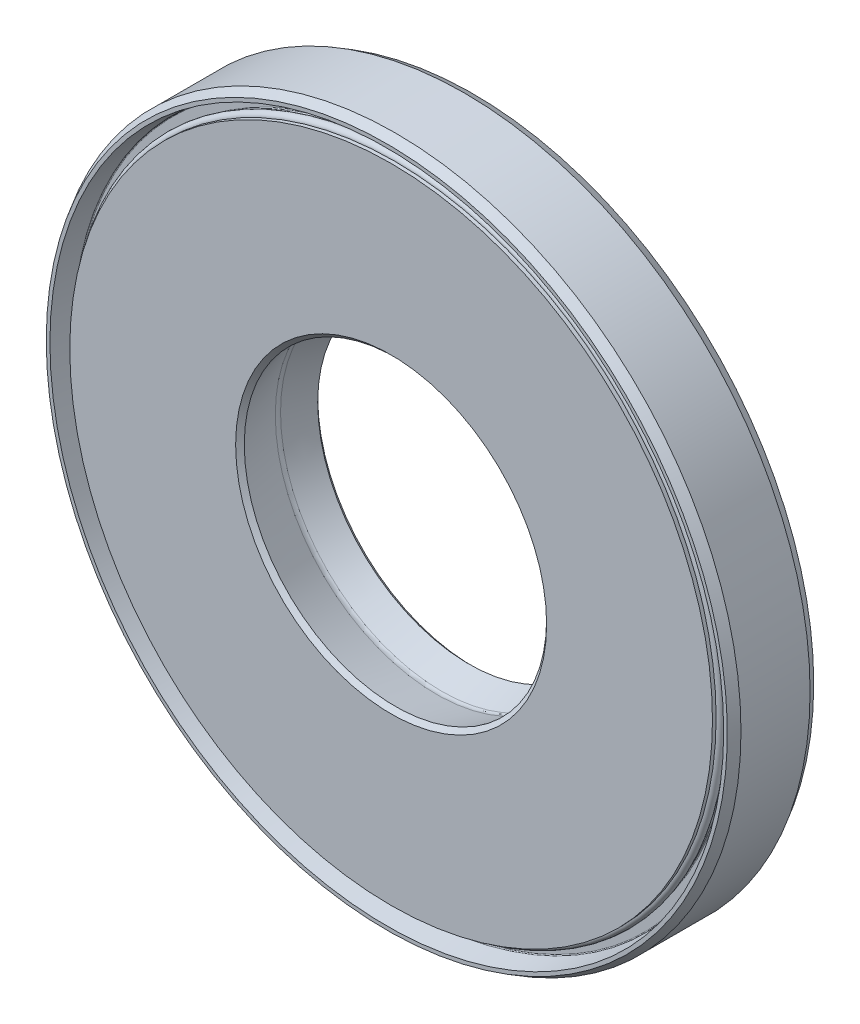
ISO-10303-21;
HEADER;
FILE_DESCRIPTION(('STEP AP214'),'2;1');
FILE_NAME('part.step','',(''),(''),'','','');
FILE_SCHEMA(('AUTOMOTIVE_DESIGN { 1 0 10303 214 1 1 1 1 }'));
ENDSEC;
DATA;
#1=APPLICATION_CONTEXT('core data for automotive mechanical design processes');
#2=APPLICATION_PROTOCOL_DEFINITION('international standard','automotive_design',2000,#1);
#3=PRODUCT_CONTEXT('',#1,'mechanical');
#4=PRODUCT('Part','Part','',(#3));
#5=PRODUCT_RELATED_PRODUCT_CATEGORY('part','',(#4));
#6=PRODUCT_DEFINITION_FORMATION('','',#4);
#7=PRODUCT_DEFINITION_CONTEXT('part definition',#1,'design');
#8=PRODUCT_DEFINITION('design','',#6,#7);
#9=PRODUCT_DEFINITION_SHAPE('','',#8);
#10=(LENGTH_UNIT() NAMED_UNIT(*) SI_UNIT(.MILLI.,.METRE.));
#11=(NAMED_UNIT(*) PLANE_ANGLE_UNIT() SI_UNIT($,.RADIAN.));
#12=(NAMED_UNIT(*) SI_UNIT($,.STERADIAN.) SOLID_ANGLE_UNIT());
#13=UNCERTAINTY_MEASURE_WITH_UNIT(LENGTH_MEASURE(1.E-05),#10,'distance_accuracy_value','');
#14=(GEOMETRIC_REPRESENTATION_CONTEXT(3) GLOBAL_UNCERTAINTY_ASSIGNED_CONTEXT((#13)) GLOBAL_UNIT_ASSIGNED_CONTEXT((#10,
#11,#12)) REPRESENTATION_CONTEXT('',''));
#15=CARTESIAN_POINT('',(0.,0.,0.));
#16=DIRECTION('',(0.,0.,1.));
#17=DIRECTION('',(1.,0.,0.));
#18=AXIS2_PLACEMENT_3D('',#15,#16,#17);
#19=CARTESIAN_POINT('',(0.,0.,-1.42307394447686));
#20=DIRECTION('',(0.,0.,-1.));
#21=DIRECTION('',(-1.,0.,0.));
#22=AXIS2_PLACEMENT_3D('',#19,#20,#21);
#23=TOROIDAL_SURFACE('',#22,37.2,0.499999999999999);
#24=CARTESIAN_POINT('',(0.,0.,-1.91820797884767));
#25=DIRECTION('',(0.,0.,-1.));
#26=DIRECTION('',(-1.,0.,0.));
#27=AXIS2_PLACEMENT_3D('',#24,#25,#26);
#28=CIRCLE('',#27,37.26958655048);
#29=CARTESIAN_POINT('',(-37.26958655048,0.,-1.91820797884765));
#30=VERTEX_POINT('',#29);
#31=EDGE_CURVE('E62',#30,#30,#28,.T.);
#32=ORIENTED_EDGE('',*,*,#31,.F.);
#33=EDGE_LOOP('',(#32));
#34=FACE_BOUND('',#33,.T.);
#35=CARTESIAN_POINT('',(0.,0.,-0.923073944476861));
#36=DIRECTION('',(0.,0.,1.));
#37=DIRECTION('',(1.,0.,0.));
#38=AXIS2_PLACEMENT_3D('',#35,#36,#37);
#39=CIRCLE('',#38,37.2);
#40=CARTESIAN_POINT('',(37.2,0.,-0.923073944476861));
#41=VERTEX_POINT('',#40);
#42=EDGE_CURVE('E57',#41,#41,#39,.T.);
#43=ORIENTED_EDGE('',*,*,#42,.F.);
#44=EDGE_LOOP('',(#43));
#45=FACE_BOUND('',#44,.T.);
#46=ADVANCED_FACE('F14',(#34,#45),#23,.T.);
#47=CARTESIAN_POINT('',(0.,0.,-2.41391731009597));
#48=DIRECTION('',(0.,0.,-1.));
#49=DIRECTION('',(-1.,0.,0.));
#50=AXIS2_PLACEMENT_3D('',#47,#48,#49);
#51=CONICAL_SURFACE('',#50,37.3392539536634,0.139626340159525);
#52=CARTESIAN_POINT('',(0.,0.,-2.413917310096));
#53=DIRECTION('',(0.,0.,-1.));
#54=DIRECTION('',(-1.,0.,0.));
#55=AXIS2_PLACEMENT_3D('',#52,#53,#54);
#56=CIRCLE('',#55,37.3392539536634);
#57=CARTESIAN_POINT('',(-37.3392539536634,0.,-2.413917310096));
#58=VERTEX_POINT('',#57);
#59=EDGE_CURVE('E53',#58,#58,#56,.F.);
#60=ORIENTED_EDGE('',*,*,#59,.T.);
#61=EDGE_LOOP('',(#60));
#62=FACE_BOUND('',#61,.T.);
#63=ORIENTED_EDGE('',*,*,#31,.T.);
#64=EDGE_LOOP('',(#63));
#65=FACE_BOUND('',#64,.T.);
#66=ADVANCED_FACE('F91',(#62,#65),#51,.T.);
#67=CARTESIAN_POINT('',(0.,0.,-50.));
#68=DIRECTION('',(0.,0.,1.));
#69=DIRECTION('',(1.,0.,0.));
#70=AXIS2_PLACEMENT_3D('',#67,#68,#69);
#71=CYLINDRICAL_SURFACE('',#70,37.2);
#72=ORIENTED_EDGE('',*,*,#42,.T.);
#73=EDGE_LOOP('',(#72));
#74=FACE_BOUND('',#73,.T.);
#75=CARTESIAN_POINT('',(0.,0.,-0.5));
#76=DIRECTION('',(0.,0.,1.));
#77=DIRECTION('',(1.,0.,0.));
#78=AXIS2_PLACEMENT_3D('',#75,#76,#77);
#79=CIRCLE('',#78,37.2);
#80=CARTESIAN_POINT('',(37.2,0.,-0.5));
#81=VERTEX_POINT('',#80);
#82=EDGE_CURVE('E18',#81,#81,#79,.T.);
#83=ORIENTED_EDGE('',*,*,#82,.F.);
#84=EDGE_LOOP('',(#83));
#85=FACE_BOUND('',#84,.T.);
#86=ADVANCED_FACE('F87',(#74,#85),#71,.T.);
#87=CARTESIAN_POINT('',(0.,0.,-2.39999999999999));
#88=DIRECTION('',(0.,0.,-1.));
#89=DIRECTION('',(-1.,0.,0.));
#90=AXIS2_PLACEMENT_3D('',#87,#88,#89);
#91=TOROIDAL_SURFACE('',#90,37.4382807605376,0.100000000000009);
#92=ORIENTED_EDGE('',*,*,#59,.F.);
#93=EDGE_LOOP('',(#92));
#94=FACE_BOUND('',#93,.T.);
#95=CARTESIAN_POINT('',(0.,0.,-2.5));
#96=DIRECTION('',(0.,0.,1.));
#97=DIRECTION('',(-1.,0.,0.));
#98=AXIS2_PLACEMENT_3D('',#95,#96,#97);
#99=CIRCLE('',#98,37.4382807605376);
#100=CARTESIAN_POINT('',(-37.4382807605376,0.,-2.5));
#101=VERTEX_POINT('',#100);
#102=EDGE_CURVE('E43',#101,#101,#99,.F.);
#103=ORIENTED_EDGE('',*,*,#102,.F.);
#104=EDGE_LOOP('',(#103));
#105=FACE_BOUND('',#104,.T.);
#106=ADVANCED_FACE('F76',(#94,#105),#91,.F.);
#107=CARTESIAN_POINT('',(0.,37.2,-0.500000000000004));
#108=DIRECTION('',(0.,0.,1.));
#109=DIRECTION('',(1.,0.,0.));
#110=AXIS2_PLACEMENT_3D('',#107,#108,#109);
#111=PLANE('',#110);
#112=ORIENTED_EDGE('',*,*,#82,.T.);
#113=EDGE_LOOP('',(#112));
#114=FACE_BOUND('',#113,.T.);
#115=CARTESIAN_POINT('',(0.,0.,-0.500000000000007));
#116=DIRECTION('',(0.,0.,1.));
#117=DIRECTION('',(1.,0.,0.));
#118=AXIS2_PLACEMENT_3D('',#115,#116,#117);
#119=CIRCLE('',#118,18.);
#120=CARTESIAN_POINT('',(18.,0.,-0.500000000000007));
#121=VERTEX_POINT('',#120);
#122=EDGE_CURVE('E40',#121,#121,#119,.F.);
#123=ORIENTED_EDGE('',*,*,#122,.T.);
#124=EDGE_LOOP('',(#123));
#125=FACE_BOUND('',#124,.T.);
#126=ADVANCED_FACE('F86',(#114,#125),#111,.T.);
#127=CARTESIAN_POINT('',(0.,38.5617192394624,-2.5));
#128=DIRECTION('',(0.,0.,1.));
#129=DIRECTION('',(1.,0.,0.));
#130=AXIS2_PLACEMENT_3D('',#127,#128,#129);
#131=PLANE('',#130);
#132=CARTESIAN_POINT('',(0.,0.,-2.5));
#133=DIRECTION('',(0.,0.,-1.));
#134=DIRECTION('',(-1.,0.,0.));
#135=AXIS2_PLACEMENT_3D('',#132,#133,#134);
#136=CIRCLE('',#135,38.5617192409525);
#137=CARTESIAN_POINT('',(-38.5617192409525,0.,-2.5));
#138=VERTEX_POINT('',#137);
#139=EDGE_CURVE('E42',#138,#138,#136,.F.);
#140=ORIENTED_EDGE('',*,*,#139,.T.);
#141=EDGE_LOOP('',(#140));
#142=FACE_BOUND('',#141,.T.);
#143=ORIENTED_EDGE('',*,*,#102,.T.);
#144=EDGE_LOOP('',(#143));
#145=FACE_BOUND('',#144,.T.);
#146=ADVANCED_FACE('F178',(#142,#145),#131,.T.);
#147=CARTESIAN_POINT('',(0.,0.,-0.500000000000007));
#148=DIRECTION('',(0.,0.,1.));
#149=DIRECTION('',(1.,0.,0.));
#150=AXIS2_PLACEMENT_3D('',#147,#148,#149);
#151=CONICAL_SURFACE('',#150,18.,0.785398163397448);
#152=ORIENTED_EDGE('',*,*,#122,.F.);
#153=EDGE_LOOP('',(#152));
#154=FACE_BOUND('',#153,.T.);
#155=CARTESIAN_POINT('',(0.,0.,-1.00000000000001));
#156=DIRECTION('',(0.,0.,-1.));
#157=DIRECTION('',(-1.,0.,0.));
#158=AXIS2_PLACEMENT_3D('',#155,#156,#157);
#159=CIRCLE('',#158,17.5);
#160=CARTESIAN_POINT('',(-17.5,0.,-1.00000000000002));
#161=VERTEX_POINT('',#160);
#162=EDGE_CURVE('E47',#161,#161,#159,.T.);
#163=ORIENTED_EDGE('',*,*,#162,.T.);
#164=EDGE_LOOP('',(#163));
#165=FACE_BOUND('',#164,.T.);
#166=ADVANCED_FACE('F167',(#154,#165),#151,.F.);
#167=CARTESIAN_POINT('',(0.,0.,-2.40000000000001));
#168=DIRECTION('',(0.,0.,-1.));
#169=DIRECTION('',(-1.,0.,0.));
#170=AXIS2_PLACEMENT_3D('',#167,#168,#169);
#171=TOROIDAL_SURFACE('',#170,38.5617192394624,0.0999999999999878);
#172=ORIENTED_EDGE('',*,*,#139,.F.);
#173=EDGE_LOOP('',(#172));
#174=FACE_BOUND('',#173,.T.);
#175=CARTESIAN_POINT('',(0.,0.,-2.41391731009599));
#176=DIRECTION('',(0.,0.,1.));
#177=DIRECTION('',(1.,0.,0.));
#178=AXIS2_PLACEMENT_3D('',#175,#176,#177);
#179=CIRCLE('',#178,38.6607460463366);
#180=CARTESIAN_POINT('',(38.6607460463366,0.,-2.41391731009596));
#181=VERTEX_POINT('',#180);
#182=EDGE_CURVE('E207',#181,#181,#179,.T.);
#183=ORIENTED_EDGE('',*,*,#182,.T.);
#184=EDGE_LOOP('',(#183));
#185=FACE_BOUND('',#184,.T.);
#186=ADVANCED_FACE('F161',(#174,#185),#171,.F.);
#187=CARTESIAN_POINT('',(0.,0.,-5.76115766558426));
#188=DIRECTION('',(0.,0.,-1.));
#189=DIRECTION('',(-1.,0.,0.));
#190=AXIS2_PLACEMENT_3D('',#187,#188,#189);
#191=CONICAL_SURFACE('',#190,18.6710583603939,0.241173507010023);
#192=ORIENTED_EDGE('',*,*,#162,.F.);
#193=EDGE_LOOP('',(#192));
#194=FACE_BOUND('',#193,.T.);
#195=CARTESIAN_POINT('',(0.,0.,-5.76115766558426));
#196=DIRECTION('',(0.,0.,-1.));
#197=DIRECTION('',(-1.,0.,0.));
#198=AXIS2_PLACEMENT_3D('',#195,#196,#197);
#199=CIRCLE('',#198,18.6710583603939);
#200=CARTESIAN_POINT('',(-18.6710583603939,0.,-5.76115766558426));
#201=VERTEX_POINT('',#200);
#202=EDGE_CURVE('E39',#201,#201,#199,.T.);
#203=ORIENTED_EDGE('',*,*,#202,.T.);
#204=EDGE_LOOP('',(#203));
#205=FACE_BOUND('',#204,.T.);
#206=ADVANCED_FACE('F157',(#194,#205),#191,.F.);
#207=CARTESIAN_POINT('',(0.,0.,0.));
#208=DIRECTION('',(0.,0.,1.));
#209=DIRECTION('',(1.,0.,0.));
#210=AXIS2_PLACEMENT_3D('',#207,#208,#209);
#211=CONICAL_SURFACE('',#210,39.,0.139626340159547);
#212=CARTESIAN_POINT('',(0.,0.,0.));
#213=DIRECTION('',(0.,0.,1.));
#214=DIRECTION('',(1.,0.,0.));
#215=AXIS2_PLACEMENT_3D('',#212,#213,#214);
#216=CIRCLE('',#215,39.);
#217=CARTESIAN_POINT('',(39.,0.,0.));
#218=VERTEX_POINT('',#217);
#219=EDGE_CURVE('E37',#218,#218,#216,.F.);
#220=ORIENTED_EDGE('',*,*,#219,.F.);
#221=EDGE_LOOP('',(#220));
#222=FACE_BOUND('',#221,.T.);
#223=ORIENTED_EDGE('',*,*,#182,.F.);
#224=EDGE_LOOP('',(#223));
#225=FACE_BOUND('',#224,.T.);
#226=ADVANCED_FACE('F152',(#222,#225),#211,.F.);
#227=CARTESIAN_POINT('',(0.,0.,-6.00000000000001));
#228=DIRECTION('',(0.,0.,-1.));
#229=DIRECTION('',(-1.,0.,0.));
#230=AXIS2_PLACEMENT_3D('',#227,#228,#229);
#231=TOROIDAL_SURFACE('',#230,17.7,1.);
#232=CARTESIAN_POINT('',(0.,0.,-6.33946394667669));
#233=DIRECTION('',(0.,0.,1.));
#234=DIRECTION('',(1.,0.,0.));
#235=AXIS2_PLACEMENT_3D('',#232,#233,#234);
#236=CIRCLE('',#235,18.640619066842);
#237=CARTESIAN_POINT('',(18.640619066842,0.,-6.33946394667669));
#238=VERTEX_POINT('',#237);
#239=EDGE_CURVE('E36',#238,#238,#236,.F.);
#240=ORIENTED_EDGE('',*,*,#239,.T.);
#241=EDGE_LOOP('',(#240));
#242=FACE_BOUND('',#241,.T.);
#243=ORIENTED_EDGE('',*,*,#202,.F.);
#244=EDGE_LOOP('',(#243));
#245=FACE_BOUND('',#244,.T.);
#246=ADVANCED_FACE('F147',(#242,#245),#231,.F.);
#247=CARTESIAN_POINT('',(0.,39.4226497308104,0.));
#248=DIRECTION('',(0.,0.,1.));
#249=DIRECTION('',(1.,0.,0.));
#250=AXIS2_PLACEMENT_3D('',#247,#248,#249);
#251=PLANE('',#250);
#252=CARTESIAN_POINT('',(0.,0.,0.));
#253=DIRECTION('',(0.,0.,-1.));
#254=DIRECTION('',(-1.,0.,0.));
#255=AXIS2_PLACEMENT_3D('',#252,#253,#254);
#256=CIRCLE('',#255,39.4226497308104);
#257=CARTESIAN_POINT('',(-39.4226497308104,0.,0.));
#258=VERTEX_POINT('',#257);
#259=EDGE_CURVE('E32',#258,#258,#256,.T.);
#260=ORIENTED_EDGE('',*,*,#259,.F.);
#261=EDGE_LOOP('',(#260));
#262=FACE_BOUND('',#261,.T.);
#263=ORIENTED_EDGE('',*,*,#219,.T.);
#264=EDGE_LOOP('',(#263));
#265=FACE_BOUND('',#264,.T.);
#266=ADVANCED_FACE('F151',(#262,#265),#251,.T.);
#267=CARTESIAN_POINT('',(0.,0.,-6.33946394667669));
#268=DIRECTION('',(0.,0.,1.));
#269=DIRECTION('',(0.,-1.,0.));
#270=AXIS2_PLACEMENT_3D('',#267,#268,#269);
#271=CONICAL_SURFACE('',#270,18.640619066842,0.346346944707762);
#272=ORIENTED_EDGE('',*,*,#239,.F.);
#273=EDGE_LOOP('',(#272));
#274=FACE_BOUND('',#273,.T.);
#275=CARTESIAN_POINT('',(0.,0.,-9.5));
#276=DIRECTION('',(0.,0.,-1.));
#277=DIRECTION('',(-1.,0.,0.));
#278=AXIS2_PLACEMENT_3D('',#275,#276,#277);
#279=CIRCLE('',#278,17.5);
#280=CARTESIAN_POINT('',(-17.5,0.,-9.5));
#281=VERTEX_POINT('',#280);
#282=EDGE_CURVE('E35',#281,#281,#279,.T.);
#283=ORIENTED_EDGE('',*,*,#282,.T.);
#284=EDGE_LOOP('',(#283));
#285=FACE_BOUND('',#284,.T.);
#286=ADVANCED_FACE('F251',(#274,#285),#271,.F.);
#287=CARTESIAN_POINT('',(0.,0.,-0.999999999999997));
#288=DIRECTION('',(0.,0.,-1.));
#289=DIRECTION('',(-1.,0.,0.));
#290=AXIS2_PLACEMENT_3D('',#287,#288,#289);
#291=CONICAL_SURFACE('',#290,40.,0.523598775598296);
#292=CARTESIAN_POINT('',(0.,0.,-1.));
#293=DIRECTION('',(0.,0.,1.));
#294=DIRECTION('',(1.,0.,0.));
#295=AXIS2_PLACEMENT_3D('',#292,#293,#294);
#296=CIRCLE('',#295,40.);
#297=CARTESIAN_POINT('',(40.,0.,-1.));
#298=VERTEX_POINT('',#297);
#299=EDGE_CURVE('E128',#298,#298,#296,.F.);
#300=ORIENTED_EDGE('',*,*,#299,.F.);
#301=EDGE_LOOP('',(#300));
#302=FACE_BOUND('',#301,.T.);
#303=ORIENTED_EDGE('',*,*,#259,.T.);
#304=EDGE_LOOP('',(#303));
#305=FACE_BOUND('',#304,.T.);
#306=ADVANCED_FACE('F258',(#302,#305),#291,.T.);
#307=CARTESIAN_POINT('',(0.,0.,-10.));
#308=DIRECTION('',(0.,0.,-1.));
#309=DIRECTION('',(0.,1.,0.));
#310=AXIS2_PLACEMENT_3D('',#307,#308,#309);
#311=CONICAL_SURFACE('',#310,18.,0.785398163397448);
#312=ORIENTED_EDGE('',*,*,#282,.F.);
#313=EDGE_LOOP('',(#312));
#314=FACE_BOUND('',#313,.T.);
#315=CARTESIAN_POINT('',(0.,0.,-10.));
#316=DIRECTION('',(0.,0.,1.));
#317=DIRECTION('',(1.,0.,0.));
#318=AXIS2_PLACEMENT_3D('',#315,#316,#317);
#319=CIRCLE('',#318,18.);
#320=CARTESIAN_POINT('',(18.,0.,-10.));
#321=VERTEX_POINT('',#320);
#322=EDGE_CURVE('E123',#321,#321,#319,.T.);
#323=ORIENTED_EDGE('',*,*,#322,.F.);
#324=EDGE_LOOP('',(#323));
#325=FACE_BOUND('',#324,.T.);
#326=ADVANCED_FACE('F265',(#314,#325),#311,.F.);
#327=CARTESIAN_POINT('',(0.,0.,-50.));
#328=DIRECTION('',(0.,0.,1.));
#329=DIRECTION('',(1.,0.,0.));
#330=AXIS2_PLACEMENT_3D('',#327,#328,#329);
#331=CYLINDRICAL_SURFACE('',#330,40.);
#332=CARTESIAN_POINT('',(0.,0.,-9.00000000000001));
#333=DIRECTION('',(0.,0.,1.));
#334=DIRECTION('',(1.,0.,0.));
#335=AXIS2_PLACEMENT_3D('',#332,#333,#334);
#336=CIRCLE('',#335,40.);
#337=CARTESIAN_POINT('',(40.,0.,-9.00000000000001));
#338=VERTEX_POINT('',#337);
#339=EDGE_CURVE('E118',#338,#338,#336,.F.);
#340=ORIENTED_EDGE('',*,*,#339,.F.);
#341=EDGE_LOOP('',(#340));
#342=FACE_BOUND('',#341,.T.);
#343=ORIENTED_EDGE('',*,*,#299,.T.);
#344=EDGE_LOOP('',(#343));
#345=FACE_BOUND('',#344,.T.);
#346=ADVANCED_FACE('F273',(#342,#345),#331,.T.);
#347=CARTESIAN_POINT('',(0.,0.,-9.30456837211232));
#348=DIRECTION('',(0.,0.,1.));
#349=DIRECTION('',(1.,0.,0.));
#350=AXIS2_PLACEMENT_3D('',#347,#348,#349);
#351=CONICAL_SURFACE('',#350,19.2045229126918,1.0471975511966);
#352=ORIENTED_EDGE('',*,*,#322,.T.);
#353=EDGE_LOOP('',(#352));
#354=FACE_BOUND('',#353,.T.);
#355=CARTESIAN_POINT('',(0.,0.,-9.3045683721123));
#356=DIRECTION('',(0.,0.,-1.));
#357=DIRECTION('',(-1.,0.,0.));
#358=AXIS2_PLACEMENT_3D('',#355,#356,#357);
#359=CIRCLE('',#358,19.2045229126918);
#360=CARTESIAN_POINT('',(-19.2045229126918,0.,-9.3045683721123));
#361=VERTEX_POINT('',#360);
#362=EDGE_CURVE('E27',#361,#361,#359,.T.);
#363=ORIENTED_EDGE('',*,*,#362,.T.);
#364=EDGE_LOOP('',(#363));
#365=FACE_BOUND('',#364,.T.);
#366=ADVANCED_FACE('F281',(#354,#365),#351,.T.);
#367=CARTESIAN_POINT('',(0.,0.,-9.00000000000001));
#368=DIRECTION('',(0.,0.,1.));
#369=DIRECTION('',(1.,0.,0.));
#370=AXIS2_PLACEMENT_3D('',#367,#368,#369);
#371=CONICAL_SURFACE('',#370,40.,0.523598775598295);
#372=CARTESIAN_POINT('',(0.,0.,-10.));
#373=DIRECTION('',(0.,0.,1.));
#374=DIRECTION('',(1.,0.,0.));
#375=AXIS2_PLACEMENT_3D('',#372,#373,#374);
#376=CIRCLE('',#375,39.4226497308104);
#377=CARTESIAN_POINT('',(39.4226497308104,0.,-10.));
#378=VERTEX_POINT('',#377);
#379=EDGE_CURVE('E22',#378,#378,#376,.F.);
#380=ORIENTED_EDGE('',*,*,#379,.F.);
#381=EDGE_LOOP('',(#380));
#382=FACE_BOUND('',#381,.T.);
#383=ORIENTED_EDGE('',*,*,#339,.T.);
#384=EDGE_LOOP('',(#383));
#385=FACE_BOUND('',#384,.T.);
#386=ADVANCED_FACE('F107',(#382,#385),#371,.T.);
#387=CARTESIAN_POINT('',(0.,0.,-10.3));
#388=DIRECTION('',(0.,0.,-1.));
#389=DIRECTION('',(-1.,0.,0.));
#390=AXIS2_PLACEMENT_3D('',#387,#388,#389);
#391=TOROIDAL_SURFACE('',#390,19.3,1.00000000000001);
#392=CARTESIAN_POINT('',(0.,0.,-10.));
#393=DIRECTION('',(0.,0.,-1.));
#394=DIRECTION('',(-1.,0.,0.));
#395=AXIS2_PLACEMENT_3D('',#392,#393,#394);
#396=CIRCLE('',#395,20.253939201417);
#397=CARTESIAN_POINT('',(-20.253939201417,0.,-10.));
#398=VERTEX_POINT('',#397);
#399=EDGE_CURVE('E10',#398,#398,#396,.F.);
#400=ORIENTED_EDGE('',*,*,#399,.F.);
#401=EDGE_LOOP('',(#400));
#402=FACE_BOUND('',#401,.T.);
#403=ORIENTED_EDGE('',*,*,#362,.F.);
#404=EDGE_LOOP('',(#403));
#405=FACE_BOUND('',#404,.T.);
#406=ADVANCED_FACE('F102',(#402,#405),#391,.F.);
#407=CARTESIAN_POINT('',(0.,20.2539392014169,-10.));
#408=DIRECTION('',(0.,0.,-1.));
#409=DIRECTION('',(-1.,0.,0.));
#410=AXIS2_PLACEMENT_3D('',#407,#408,#409);
#411=PLANE('',#410);
#412=ORIENTED_EDGE('',*,*,#399,.T.);
#413=EDGE_LOOP('',(#412));
#414=FACE_BOUND('',#413,.T.);
#415=ORIENTED_EDGE('',*,*,#379,.T.);
#416=EDGE_LOOP('',(#415));
#417=FACE_BOUND('',#416,.T.);
#418=ADVANCED_FACE('F100',(#414,#417),#411,.T.);
#419=CLOSED_SHELL('',(#46,#66,#86,#106,#126,#146,#166,#186,#206,#226,#246,#266,#286,#306,#326,
#346,#366,#386,#406,#418));
#420=MANIFOLD_SOLID_BREP('B1',#419);
#421=ADVANCED_BREP_SHAPE_REPRESENTATION('',(#18,#420),#14);
#422=SHAPE_DEFINITION_REPRESENTATION(#9,#421);
ENDSEC;
END-ISO-10303-21;
